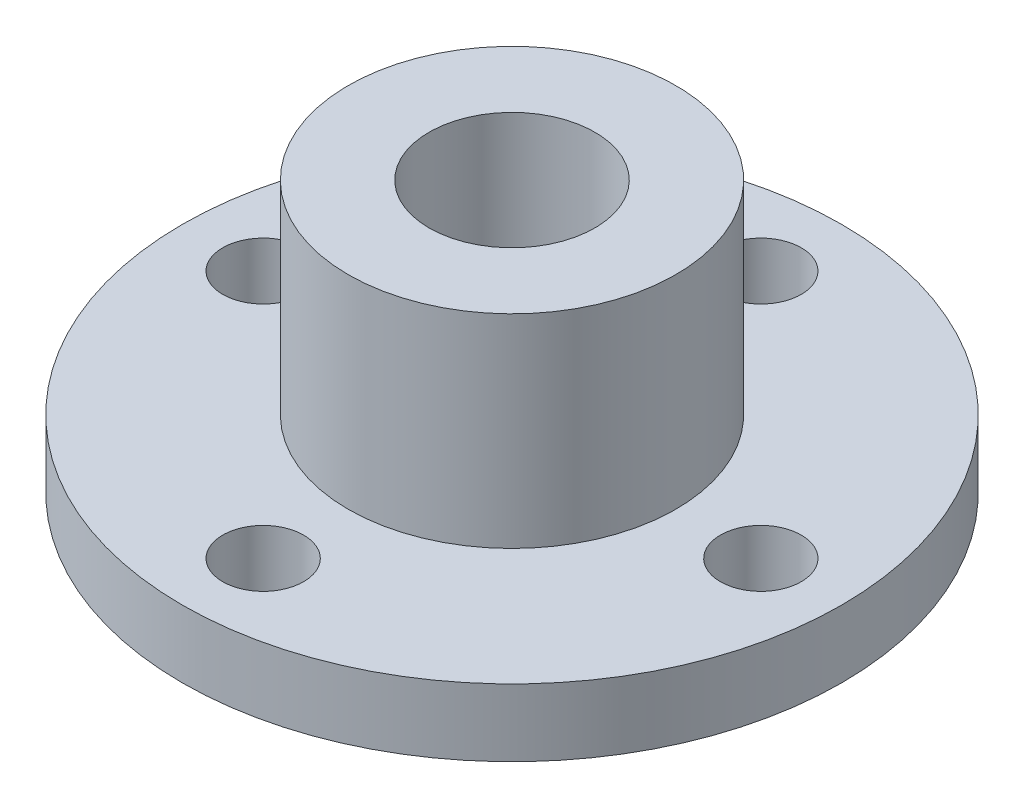
ISO-10303-21;
HEADER;
FILE_DESCRIPTION(('STEP AP214'),'2;1');
FILE_NAME('part.step','',(''),(''),'','','');
FILE_SCHEMA(('AUTOMOTIVE_DESIGN { 1 0 10303 214 1 1 1 1 }'));
ENDSEC;
DATA;
#1=APPLICATION_CONTEXT('core data for automotive mechanical design processes');
#2=APPLICATION_PROTOCOL_DEFINITION('international standard','automotive_design',2000,#1);
#3=PRODUCT_CONTEXT('',#1,'mechanical');
#4=PRODUCT('Part','Part','',(#3));
#5=PRODUCT_RELATED_PRODUCT_CATEGORY('part','',(#4));
#6=PRODUCT_DEFINITION_FORMATION('','',#4);
#7=PRODUCT_DEFINITION_CONTEXT('part definition',#1,'design');
#8=PRODUCT_DEFINITION('design','',#6,#7);
#9=PRODUCT_DEFINITION_SHAPE('','',#8);
#10=(LENGTH_UNIT() NAMED_UNIT(*) SI_UNIT(.MILLI.,.METRE.));
#11=(NAMED_UNIT(*) PLANE_ANGLE_UNIT() SI_UNIT($,.RADIAN.));
#12=(NAMED_UNIT(*) SI_UNIT($,.STERADIAN.) SOLID_ANGLE_UNIT());
#13=UNCERTAINTY_MEASURE_WITH_UNIT(LENGTH_MEASURE(1.E-05),#10,'distance_accuracy_value','');
#14=(GEOMETRIC_REPRESENTATION_CONTEXT(3) GLOBAL_UNCERTAINTY_ASSIGNED_CONTEXT((#13)) GLOBAL_UNIT_ASSIGNED_CONTEXT((#10,
#11,#12)) REPRESENTATION_CONTEXT('',''));
#15=CARTESIAN_POINT('',(0.,0.,0.));
#16=DIRECTION('',(0.,0.,1.));
#17=DIRECTION('',(1.,0.,0.));
#18=AXIS2_PLACEMENT_3D('',#15,#16,#17);
#19=CARTESIAN_POINT('',(0.,13.05,0.));
#20=DIRECTION('',(0.,1.,0.));
#21=DIRECTION('',(0.,0.,1.));
#22=AXIS2_PLACEMENT_3D('',#19,#20,#21);
#23=PLANE('',#22);
#24=CARTESIAN_POINT('',(0.,13.05,0.));
#25=DIRECTION('',(0.,1.,0.));
#26=DIRECTION('',(0.,0.,1.));
#27=AXIS2_PLACEMENT_3D('',#24,#25,#26);
#28=CIRCLE('',#27,4.);
#29=CARTESIAN_POINT('',(0.,13.05,4.));
#30=VERTEX_POINT('',#29);
#31=EDGE_CURVE('E44',#30,#30,#28,.T.);
#32=ORIENTED_EDGE('',*,*,#31,.F.);
#33=EDGE_LOOP('',(#32));
#34=FACE_BOUND('',#33,.T.);
#35=CARTESIAN_POINT('',(0.,13.05,0.));
#36=DIRECTION('',(0.,1.,0.));
#37=DIRECTION('',(0.,0.,1.));
#38=AXIS2_PLACEMENT_3D('',#35,#36,#37);
#39=CIRCLE('',#38,7.9);
#40=CARTESIAN_POINT('',(0.,13.05,7.9));
#41=VERTEX_POINT('',#40);
#42=EDGE_CURVE('E58',#41,#41,#39,.T.);
#43=ORIENTED_EDGE('',*,*,#42,.T.);
#44=EDGE_LOOP('',(#43));
#45=FACE_BOUND('',#44,.T.);
#46=ADVANCED_FACE('F37',(#34,#45),#23,.T.);
#47=CARTESIAN_POINT('',(0.,13.05,0.));
#48=DIRECTION('',(0.,-1.,0.));
#49=DIRECTION('',(0.,0.,-1.));
#50=AXIS2_PLACEMENT_3D('',#47,#48,#49);
#51=CYLINDRICAL_SURFACE('',#50,15.9);
#52=CARTESIAN_POINT('',(0.,0.,0.));
#53=DIRECTION('',(0.,1.,0.));
#54=DIRECTION('',(0.,0.,1.));
#55=AXIS2_PLACEMENT_3D('',#52,#53,#54);
#56=CIRCLE('',#55,15.9);
#57=CARTESIAN_POINT('',(0.,0.,15.9));
#58=VERTEX_POINT('',#57);
#59=EDGE_CURVE('E10',#58,#58,#56,.T.);
#60=ORIENTED_EDGE('',*,*,#59,.T.);
#61=EDGE_LOOP('',(#60));
#62=FACE_BOUND('',#61,.T.);
#63=CARTESIAN_POINT('',(0.,3.25,0.));
#64=DIRECTION('',(0.,1.,0.));
#65=DIRECTION('',(0.,0.,1.));
#66=AXIS2_PLACEMENT_3D('',#63,#64,#65);
#67=CIRCLE('',#66,15.9);
#68=CARTESIAN_POINT('',(0.,3.25,15.9));
#69=VERTEX_POINT('',#68);
#70=EDGE_CURVE('E53',#69,#69,#67,.T.);
#71=ORIENTED_EDGE('',*,*,#70,.F.);
#72=EDGE_LOOP('',(#71));
#73=FACE_BOUND('',#72,.T.);
#74=ADVANCED_FACE('F39',(#62,#73),#51,.T.);
#75=CARTESIAN_POINT('',(0.,0.,0.));
#76=DIRECTION('',(0.,1.,0.));
#77=DIRECTION('',(0.,0.,1.));
#78=AXIS2_PLACEMENT_3D('',#75,#76,#77);
#79=PLANE('',#78);
#80=CARTESIAN_POINT('',(0.,0.,-12.));
#81=DIRECTION('',(0.,1.,0.));
#82=DIRECTION('',(0.,0.,1.));
#83=AXIS2_PLACEMENT_3D('',#80,#81,#82);
#84=CIRCLE('',#83,1.95);
#85=CARTESIAN_POINT('',(0.,0.,-10.05));
#86=VERTEX_POINT('',#85);
#87=EDGE_CURVE('E61',#86,#86,#84,.T.);
#88=ORIENTED_EDGE('',*,*,#87,.T.);
#89=EDGE_LOOP('',(#88));
#90=FACE_BOUND('',#89,.T.);
#91=CARTESIAN_POINT('',(12.,0.,0.));
#92=DIRECTION('',(0.,1.,0.));
#93=DIRECTION('',(0.,0.,1.));
#94=AXIS2_PLACEMENT_3D('',#91,#92,#93);
#95=CIRCLE('',#94,1.95);
#96=CARTESIAN_POINT('',(12.,0.,1.95000000000004));
#97=VERTEX_POINT('',#96);
#98=EDGE_CURVE('E66',#97,#97,#95,.T.);
#99=ORIENTED_EDGE('',*,*,#98,.T.);
#100=EDGE_LOOP('',(#99));
#101=FACE_BOUND('',#100,.T.);
#102=CARTESIAN_POINT('',(0.,0.,12.));
#103=DIRECTION('',(0.,1.,0.));
#104=DIRECTION('',(0.,0.,1.));
#105=AXIS2_PLACEMENT_3D('',#102,#103,#104);
#106=CIRCLE('',#105,1.95);
#107=CARTESIAN_POINT('',(0.,0.,13.95));
#108=VERTEX_POINT('',#107);
#109=EDGE_CURVE('E69',#108,#108,#106,.T.);
#110=ORIENTED_EDGE('',*,*,#109,.T.);
#111=EDGE_LOOP('',(#110));
#112=FACE_BOUND('',#111,.T.);
#113=CARTESIAN_POINT('',(-12.,0.,-1.25693328198353E-13));
#114=DIRECTION('',(0.,1.,0.));
#115=DIRECTION('',(0.,0.,1.));
#116=AXIS2_PLACEMENT_3D('',#113,#114,#115);
#117=CIRCLE('',#116,1.95);
#118=CARTESIAN_POINT('',(-12.,0.,1.94999999999987));
#119=VERTEX_POINT('',#118);
#120=EDGE_CURVE('E72',#119,#119,#117,.T.);
#121=ORIENTED_EDGE('',*,*,#120,.T.);
#122=EDGE_LOOP('',(#121));
#123=FACE_BOUND('',#122,.T.);
#124=ORIENTED_EDGE('',*,*,#59,.F.);
#125=EDGE_LOOP('',(#124));
#126=FACE_BOUND('',#125,.T.);
#127=CARTESIAN_POINT('',(0.,0.,0.));
#128=DIRECTION('',(0.,1.,0.));
#129=DIRECTION('',(0.,0.,1.));
#130=AXIS2_PLACEMENT_3D('',#127,#128,#129);
#131=CIRCLE('',#130,4.);
#132=CARTESIAN_POINT('',(0.,0.,4.));
#133=VERTEX_POINT('',#132);
#134=EDGE_CURVE('E48',#133,#133,#131,.T.);
#135=ORIENTED_EDGE('',*,*,#134,.T.);
#136=EDGE_LOOP('',(#135));
#137=FACE_BOUND('',#136,.T.);
#138=ADVANCED_FACE('F108',(#90,#101,#112,#123,#126,#137),#79,.F.);
#139=CARTESIAN_POINT('',(0.,13.05,0.));
#140=DIRECTION('',(0.,-1.,0.));
#141=DIRECTION('',(0.,0.,-1.));
#142=AXIS2_PLACEMENT_3D('',#139,#140,#141);
#143=CYLINDRICAL_SURFACE('',#142,4.);
#144=ORIENTED_EDGE('',*,*,#31,.T.);
#145=EDGE_LOOP('',(#144));
#146=FACE_BOUND('',#145,.T.);
#147=ORIENTED_EDGE('',*,*,#134,.F.);
#148=EDGE_LOOP('',(#147));
#149=FACE_BOUND('',#148,.T.);
#150=ADVANCED_FACE('F95',(#146,#149),#143,.F.);
#151=CARTESIAN_POINT('',(0.,3.25,0.));
#152=DIRECTION('',(0.,1.,0.));
#153=DIRECTION('',(0.,0.,1.));
#154=AXIS2_PLACEMENT_3D('',#151,#152,#153);
#155=PLANE('',#154);
#156=CARTESIAN_POINT('',(0.,3.25,-12.));
#157=DIRECTION('',(0.,1.,0.));
#158=DIRECTION('',(0.,0.,1.));
#159=AXIS2_PLACEMENT_3D('',#156,#157,#158);
#160=CIRCLE('',#159,1.95);
#161=CARTESIAN_POINT('',(0.,3.25,-10.05));
#162=VERTEX_POINT('',#161);
#163=EDGE_CURVE('E75',#162,#162,#160,.T.);
#164=ORIENTED_EDGE('',*,*,#163,.F.);
#165=EDGE_LOOP('',(#164));
#166=FACE_BOUND('',#165,.T.);
#167=CARTESIAN_POINT('',(12.,3.25,0.));
#168=DIRECTION('',(0.,1.,0.));
#169=DIRECTION('',(0.,0.,1.));
#170=AXIS2_PLACEMENT_3D('',#167,#168,#169);
#171=CIRCLE('',#170,1.95);
#172=CARTESIAN_POINT('',(12.,3.25,1.95000000000004));
#173=VERTEX_POINT('',#172);
#174=EDGE_CURVE('E82',#173,#173,#171,.T.);
#175=ORIENTED_EDGE('',*,*,#174,.F.);
#176=EDGE_LOOP('',(#175));
#177=FACE_BOUND('',#176,.T.);
#178=CARTESIAN_POINT('',(0.,3.25,12.));
#179=DIRECTION('',(0.,1.,0.));
#180=DIRECTION('',(0.,0.,1.));
#181=AXIS2_PLACEMENT_3D('',#178,#179,#180);
#182=CIRCLE('',#181,1.95);
#183=CARTESIAN_POINT('',(0.,3.25,13.95));
#184=VERTEX_POINT('',#183);
#185=EDGE_CURVE('E79',#184,#184,#182,.T.);
#186=ORIENTED_EDGE('',*,*,#185,.F.);
#187=EDGE_LOOP('',(#186));
#188=FACE_BOUND('',#187,.T.);
#189=CARTESIAN_POINT('',(-12.,3.25,-1.25693328198353E-13));
#190=DIRECTION('',(0.,1.,0.));
#191=DIRECTION('',(0.,0.,1.));
#192=AXIS2_PLACEMENT_3D('',#189,#190,#191);
#193=CIRCLE('',#192,1.95);
#194=CARTESIAN_POINT('',(-12.,3.25,1.94999999999987));
#195=VERTEX_POINT('',#194);
#196=EDGE_CURVE('E76',#195,#195,#193,.T.);
#197=ORIENTED_EDGE('',*,*,#196,.F.);
#198=EDGE_LOOP('',(#197));
#199=FACE_BOUND('',#198,.T.);
#200=CARTESIAN_POINT('',(0.,3.25,0.));
#201=DIRECTION('',(0.,1.,0.));
#202=DIRECTION('',(0.,0.,1.));
#203=AXIS2_PLACEMENT_3D('',#200,#201,#202);
#204=CIRCLE('',#203,7.9);
#205=CARTESIAN_POINT('',(0.,3.25,7.9));
#206=VERTEX_POINT('',#205);
#207=EDGE_CURVE('E57',#206,#206,#204,.T.);
#208=ORIENTED_EDGE('',*,*,#207,.F.);
#209=EDGE_LOOP('',(#208));
#210=FACE_BOUND('',#209,.T.);
#211=ORIENTED_EDGE('',*,*,#70,.T.);
#212=EDGE_LOOP('',(#211));
#213=FACE_BOUND('',#212,.T.);
#214=ADVANCED_FACE('F91',(#166,#177,#188,#199,#210,#213),#155,.T.);
#215=CARTESIAN_POINT('',(0.,3.25,0.));
#216=DIRECTION('',(0.,1.,0.));
#217=DIRECTION('',(0.,0.,1.));
#218=AXIS2_PLACEMENT_3D('',#215,#216,#217);
#219=CYLINDRICAL_SURFACE('',#218,7.9);
#220=ORIENTED_EDGE('',*,*,#207,.T.);
#221=EDGE_LOOP('',(#220));
#222=FACE_BOUND('',#221,.T.);
#223=ORIENTED_EDGE('',*,*,#42,.F.);
#224=EDGE_LOOP('',(#223));
#225=FACE_BOUND('',#224,.T.);
#226=ADVANCED_FACE('F94',(#222,#225),#219,.T.);
#227=CARTESIAN_POINT('',(-12.,-6.55,-1.25693328198353E-13));
#228=DIRECTION('',(0.,1.,0.));
#229=DIRECTION('',(0.,0.,1.));
#230=AXIS2_PLACEMENT_3D('',#227,#228,#229);
#231=CYLINDRICAL_SURFACE('',#230,1.95);
#232=ORIENTED_EDGE('',*,*,#196,.T.);
#233=EDGE_LOOP('',(#232));
#234=FACE_BOUND('',#233,.T.);
#235=ORIENTED_EDGE('',*,*,#120,.F.);
#236=EDGE_LOOP('',(#235));
#237=FACE_BOUND('',#236,.T.);
#238=ADVANCED_FACE('F124',(#234,#237),#231,.F.);
#239=CARTESIAN_POINT('',(0.,-6.55,12.));
#240=DIRECTION('',(0.,1.,0.));
#241=DIRECTION('',(0.,0.,1.));
#242=AXIS2_PLACEMENT_3D('',#239,#240,#241);
#243=CYLINDRICAL_SURFACE('',#242,1.95);
#244=ORIENTED_EDGE('',*,*,#185,.T.);
#245=EDGE_LOOP('',(#244));
#246=FACE_BOUND('',#245,.T.);
#247=ORIENTED_EDGE('',*,*,#109,.F.);
#248=EDGE_LOOP('',(#247));
#249=FACE_BOUND('',#248,.T.);
#250=ADVANCED_FACE('F128',(#246,#249),#243,.F.);
#251=CARTESIAN_POINT('',(12.,-6.55,0.));
#252=DIRECTION('',(0.,1.,0.));
#253=DIRECTION('',(0.,0.,1.));
#254=AXIS2_PLACEMENT_3D('',#251,#252,#253);
#255=CYLINDRICAL_SURFACE('',#254,1.95);
#256=ORIENTED_EDGE('',*,*,#174,.T.);
#257=EDGE_LOOP('',(#256));
#258=FACE_BOUND('',#257,.T.);
#259=ORIENTED_EDGE('',*,*,#98,.F.);
#260=EDGE_LOOP('',(#259));
#261=FACE_BOUND('',#260,.T.);
#262=ADVANCED_FACE('F132',(#258,#261),#255,.F.);
#263=CARTESIAN_POINT('',(0.,-6.55,-12.));
#264=DIRECTION('',(0.,1.,0.));
#265=DIRECTION('',(0.,0.,1.));
#266=AXIS2_PLACEMENT_3D('',#263,#264,#265);
#267=CYLINDRICAL_SURFACE('',#266,1.95);
#268=ORIENTED_EDGE('',*,*,#163,.T.);
#269=EDGE_LOOP('',(#268));
#270=FACE_BOUND('',#269,.T.);
#271=ORIENTED_EDGE('',*,*,#87,.F.);
#272=EDGE_LOOP('',(#271));
#273=FACE_BOUND('',#272,.T.);
#274=ADVANCED_FACE('F88',(#270,#273),#267,.F.);
#275=CLOSED_SHELL('',(#46,#74,#138,#150,#214,#226,#238,#250,#262,#274));
#276=MANIFOLD_SOLID_BREP('B2',#275);
#277=ADVANCED_BREP_SHAPE_REPRESENTATION('',(#18,#276),#14);
#278=SHAPE_DEFINITION_REPRESENTATION(#9,#277);
ENDSEC;
END-ISO-10303-21;
